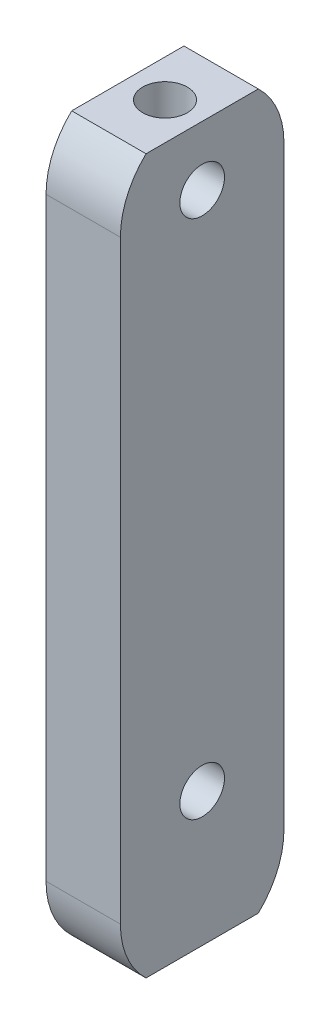
ISO-10303-21;
HEADER;
FILE_DESCRIPTION(('STEP AP214'),'2;1');
FILE_NAME('part.step','',(''),(''),'','','');
FILE_SCHEMA(('AUTOMOTIVE_DESIGN { 1 0 10303 214 1 1 1 1 }'));
ENDSEC;
DATA;
#1=APPLICATION_CONTEXT('core data for automotive mechanical design processes');
#2=APPLICATION_PROTOCOL_DEFINITION('international standard','automotive_design',2000,#1);
#3=PRODUCT_CONTEXT('',#1,'mechanical');
#4=PRODUCT('Part','Part','',(#3));
#5=PRODUCT_RELATED_PRODUCT_CATEGORY('part','',(#4));
#6=PRODUCT_DEFINITION_FORMATION('','',#4);
#7=PRODUCT_DEFINITION_CONTEXT('part definition',#1,'design');
#8=PRODUCT_DEFINITION('design','',#6,#7);
#9=PRODUCT_DEFINITION_SHAPE('','',#8);
#10=(LENGTH_UNIT() NAMED_UNIT(*) SI_UNIT(.MILLI.,.METRE.));
#11=(NAMED_UNIT(*) PLANE_ANGLE_UNIT() SI_UNIT($,.RADIAN.));
#12=(NAMED_UNIT(*) SI_UNIT($,.STERADIAN.) SOLID_ANGLE_UNIT());
#13=UNCERTAINTY_MEASURE_WITH_UNIT(LENGTH_MEASURE(1.E-05),#10,'distance_accuracy_value','');
#14=(GEOMETRIC_REPRESENTATION_CONTEXT(3) GLOBAL_UNCERTAINTY_ASSIGNED_CONTEXT((#13)) GLOBAL_UNIT_ASSIGNED_CONTEXT((#10,
#11,#12)) REPRESENTATION_CONTEXT('',''));
#15=CARTESIAN_POINT('',(0.,0.,0.));
#16=DIRECTION('',(0.,0.,1.));
#17=DIRECTION('',(1.,0.,0.));
#18=AXIS2_PLACEMENT_3D('',#15,#16,#17);
#19=CARTESIAN_POINT('',(5.,20.,0.));
#20=DIRECTION('',(-1.,0.,0.));
#21=DIRECTION('',(0.,0.,1.));
#22=AXIS2_PLACEMENT_3D('',#19,#20,#21);
#23=CYLINDRICAL_SURFACE('',#22,1.5);
#24=CARTESIAN_POINT('',(5.,20.,0.));
#25=DIRECTION('',(1.,0.,0.));
#26=DIRECTION('',(0.,0.,-1.));
#27=AXIS2_PLACEMENT_3D('',#24,#25,#26);
#28=CIRCLE('',#27,1.5);
#29=CARTESIAN_POINT('',(5.,20.,-1.49999999999999));
#30=VERTEX_POINT('',#29);
#31=EDGE_CURVE('E155',#30,#30,#28,.T.);
#32=ORIENTED_EDGE('',*,*,#31,.T.);
#33=EDGE_LOOP('',(#32));
#34=FACE_BOUND('',#33,.T.);
#35=CARTESIAN_POINT('',(0.,20.,0.));
#36=DIRECTION('',(1.,0.,0.));
#37=DIRECTION('',(0.,0.,-1.));
#38=AXIS2_PLACEMENT_3D('',#35,#36,#37);
#39=CIRCLE('',#38,1.5);
#40=CARTESIAN_POINT('',(0.,20.,-1.49999999999999));
#41=VERTEX_POINT('',#40);
#42=EDGE_CURVE('E222',#41,#41,#39,.T.);
#43=ORIENTED_EDGE('',*,*,#42,.F.);
#44=EDGE_LOOP('',(#43));
#45=FACE_BOUND('',#44,.T.);
#46=CARTESIAN_POINT('',(2.5,20.,0.));
#47=DIRECTION('',(-0.707106781186547,-0.707106781186547,0.));
#48=DIRECTION('',(-0.707106781186547,0.707106781186547,0.));
#49=AXIS2_PLACEMENT_3D('',#46,#47,#48);
#50=ELLIPSE('',#49,2.12132034355964,1.5);
#51=CARTESIAN_POINT('',(2.5,20.,-1.49999999999999));
#52=VERTEX_POINT('',#51);
#53=CARTESIAN_POINT('',(2.5,20.,1.50000000000001));
#54=VERTEX_POINT('',#53);
#55=EDGE_CURVE('E48',#52,#54,#50,.F.);
#56=ORIENTED_EDGE('',*,*,#55,.T.);
#57=CARTESIAN_POINT('',(2.5,20.,0.));
#58=DIRECTION('',(-0.707106781186547,0.707106781186547,0.));
#59=DIRECTION('',(-0.707106781186547,-0.707106781186547,0.));
#60=AXIS2_PLACEMENT_3D('',#57,#58,#59);
#61=ELLIPSE('',#60,2.12132034355964,1.5);
#62=EDGE_CURVE('E11',#54,#52,#61,.T.);
#63=ORIENTED_EDGE('',*,*,#62,.T.);
#64=EDGE_LOOP('',(#56,#63));
#65=FACE_BOUND('',#64,.T.);
#66=ADVANCED_FACE('F39',(#34,#45,#65),#23,.F.);
#67=CARTESIAN_POINT('',(5.,20.,0.));
#68=DIRECTION('',(-1.,0.,0.));
#69=DIRECTION('',(0.,0.,1.));
#70=AXIS2_PLACEMENT_3D('',#67,#68,#69);
#71=PLANE('',#70);
#72=CARTESIAN_POINT('',(5.,20.,0.));
#73=DIRECTION('',(1.,0.,0.));
#74=DIRECTION('',(0.,0.,1.));
#75=AXIS2_PLACEMENT_3D('',#72,#73,#74);
#76=CIRCLE('',#75,5.49999999999999);
#77=CARTESIAN_POINT('',(5.,24.,3.77491721763538));
#78=VERTEX_POINT('',#77);
#79=CARTESIAN_POINT('',(5.,20.,5.49999999999999));
#80=VERTEX_POINT('',#79);
#81=EDGE_CURVE('E174',#78,#80,#76,.T.);
#82=ORIENTED_EDGE('',*,*,#81,.T.);
#83=DIRECTION('',(0.,-1.,0.));
#84=VECTOR('',#83,1.);
#85=CARTESIAN_POINT('',(5.,20.,5.49999999999999));
#86=LINE('',#85,#84);
#87=CARTESIAN_POINT('',(5.,-20.,5.49999999999998));
#88=VERTEX_POINT('',#87);
#89=EDGE_CURVE('E103',#80,#88,#86,.T.);
#90=ORIENTED_EDGE('',*,*,#89,.T.);
#91=CARTESIAN_POINT('',(5.,-20.,0.));
#92=DIRECTION('',(1.,0.,0.));
#93=DIRECTION('',(0.,0.,1.));
#94=AXIS2_PLACEMENT_3D('',#91,#92,#93);
#95=CIRCLE('',#94,5.49999999999999);
#96=CARTESIAN_POINT('',(5.,-24.,3.77491721763537));
#97=VERTEX_POINT('',#96);
#98=EDGE_CURVE('E236',#88,#97,#95,.T.);
#99=ORIENTED_EDGE('',*,*,#98,.T.);
#100=DIRECTION('',(0.,0.,-1.));
#101=VECTOR('',#100,1.);
#102=CARTESIAN_POINT('',(5.,-24.,3.77491721763538));
#103=LINE('',#102,#101);
#104=CARTESIAN_POINT('',(5.,-24.,-3.77491721763538));
#105=VERTEX_POINT('',#104);
#106=EDGE_CURVE('E239',#97,#105,#103,.T.);
#107=ORIENTED_EDGE('',*,*,#106,.T.);
#108=CARTESIAN_POINT('',(5.,-20.,0.));
#109=DIRECTION('',(1.,0.,0.));
#110=DIRECTION('',(0.,0.,1.));
#111=AXIS2_PLACEMENT_3D('',#108,#109,#110);
#112=CIRCLE('',#111,5.5);
#113=CARTESIAN_POINT('',(5.,-20.,-5.5));
#114=VERTEX_POINT('',#113);
#115=EDGE_CURVE('E125',#105,#114,#112,.T.);
#116=ORIENTED_EDGE('',*,*,#115,.T.);
#117=DIRECTION('',(0.,1.,0.));
#118=VECTOR('',#117,1.);
#119=CARTESIAN_POINT('',(5.,20.,-5.49999999999999));
#120=LINE('',#119,#118);
#121=CARTESIAN_POINT('',(5.,20.,-5.49999999999999));
#122=VERTEX_POINT('',#121);
#123=EDGE_CURVE('E117',#114,#122,#120,.T.);
#124=ORIENTED_EDGE('',*,*,#123,.T.);
#125=CARTESIAN_POINT('',(5.,20.,0.));
#126=DIRECTION('',(1.,0.,0.));
#127=DIRECTION('',(0.,0.,1.));
#128=AXIS2_PLACEMENT_3D('',#125,#126,#127);
#129=CIRCLE('',#128,5.5);
#130=CARTESIAN_POINT('',(5.,24.,-3.77491721763538));
#131=VERTEX_POINT('',#130);
#132=EDGE_CURVE('E122',#122,#131,#129,.T.);
#133=ORIENTED_EDGE('',*,*,#132,.T.);
#134=DIRECTION('',(0.,0.,1.));
#135=VECTOR('',#134,1.);
#136=CARTESIAN_POINT('',(5.,24.,3.77491721763538));
#137=LINE('',#136,#135);
#138=EDGE_CURVE('E61',#131,#78,#137,.T.);
#139=ORIENTED_EDGE('',*,*,#138,.T.);
#140=EDGE_LOOP('',(#82,#90,#99,#107,#116,#124,#133,#139));
#141=FACE_BOUND('',#140,.T.);
#142=ORIENTED_EDGE('',*,*,#31,.F.);
#143=EDGE_LOOP('',(#142));
#144=FACE_BOUND('',#143,.T.);
#145=CARTESIAN_POINT('',(5.,-15.,0.));
#146=DIRECTION('',(1.,0.,0.));
#147=DIRECTION('',(0.,0.,-1.));
#148=AXIS2_PLACEMENT_3D('',#145,#146,#147);
#149=CIRCLE('',#148,1.5);
#150=CARTESIAN_POINT('',(5.,-15.,-1.5));
#151=VERTEX_POINT('',#150);
#152=EDGE_CURVE('E218',#151,#151,#149,.T.);
#153=ORIENTED_EDGE('',*,*,#152,.F.);
#154=EDGE_LOOP('',(#153));
#155=FACE_BOUND('',#154,.T.);
#156=ADVANCED_FACE('F119',(#141,#144,#155),#71,.F.);
#157=CARTESIAN_POINT('',(0.,20.,0.));
#158=DIRECTION('',(-1.,0.,0.));
#159=DIRECTION('',(0.,0.,1.));
#160=AXIS2_PLACEMENT_3D('',#157,#158,#159);
#161=PLANE('',#160);
#162=ORIENTED_EDGE('',*,*,#42,.T.);
#163=EDGE_LOOP('',(#162));
#164=FACE_BOUND('',#163,.T.);
#165=CARTESIAN_POINT('',(0.,20.,0.));
#166=DIRECTION('',(1.,0.,0.));
#167=DIRECTION('',(0.,0.,1.));
#168=AXIS2_PLACEMENT_3D('',#165,#166,#167);
#169=CIRCLE('',#168,5.49999999999999);
#170=CARTESIAN_POINT('',(0.,24.,3.77491721763538));
#171=VERTEX_POINT('',#170);
#172=CARTESIAN_POINT('',(0.,20.,5.49999999999999));
#173=VERTEX_POINT('',#172);
#174=EDGE_CURVE('E150',#171,#173,#169,.T.);
#175=ORIENTED_EDGE('',*,*,#174,.F.);
#176=DIRECTION('',(0.,0.,1.));
#177=VECTOR('',#176,1.);
#178=CARTESIAN_POINT('',(0.,24.,3.77491721763538));
#179=LINE('',#178,#177);
#180=CARTESIAN_POINT('',(0.,24.,-3.77491721763538));
#181=VERTEX_POINT('',#180);
#182=EDGE_CURVE('E94',#181,#171,#179,.T.);
#183=ORIENTED_EDGE('',*,*,#182,.F.);
#184=CARTESIAN_POINT('',(0.,20.,0.));
#185=DIRECTION('',(1.,0.,0.));
#186=DIRECTION('',(0.,0.,1.));
#187=AXIS2_PLACEMENT_3D('',#184,#185,#186);
#188=CIRCLE('',#187,5.5);
#189=CARTESIAN_POINT('',(0.,20.,-5.49999999999999));
#190=VERTEX_POINT('',#189);
#191=EDGE_CURVE('E169',#190,#181,#188,.T.);
#192=ORIENTED_EDGE('',*,*,#191,.F.);
#193=DIRECTION('',(0.,1.,0.));
#194=VECTOR('',#193,1.);
#195=CARTESIAN_POINT('',(0.,20.,-5.49999999999999));
#196=LINE('',#195,#194);
#197=CARTESIAN_POINT('',(0.,-20.,-5.5));
#198=VERTEX_POINT('',#197);
#199=EDGE_CURVE('E135',#198,#190,#196,.T.);
#200=ORIENTED_EDGE('',*,*,#199,.F.);
#201=CARTESIAN_POINT('',(0.,-20.,0.));
#202=DIRECTION('',(1.,0.,0.));
#203=DIRECTION('',(0.,0.,1.));
#204=AXIS2_PLACEMENT_3D('',#201,#202,#203);
#205=CIRCLE('',#204,5.5);
#206=CARTESIAN_POINT('',(0.,-24.,-3.77491721763538));
#207=VERTEX_POINT('',#206);
#208=EDGE_CURVE('E164',#207,#198,#205,.T.);
#209=ORIENTED_EDGE('',*,*,#208,.F.);
#210=DIRECTION('',(0.,0.,-1.));
#211=VECTOR('',#210,1.);
#212=CARTESIAN_POINT('',(0.,-24.,3.77491721763538));
#213=LINE('',#212,#211);
#214=CARTESIAN_POINT('',(0.,-24.,3.77491721763537));
#215=VERTEX_POINT('',#214);
#216=EDGE_CURVE('E161',#215,#207,#213,.T.);
#217=ORIENTED_EDGE('',*,*,#216,.F.);
#218=CARTESIAN_POINT('',(0.,-20.,0.));
#219=DIRECTION('',(1.,0.,0.));
#220=DIRECTION('',(0.,0.,1.));
#221=AXIS2_PLACEMENT_3D('',#218,#219,#220);
#222=CIRCLE('',#221,5.49999999999999);
#223=CARTESIAN_POINT('',(0.,-20.,5.49999999999998));
#224=VERTEX_POINT('',#223);
#225=EDGE_CURVE('E158',#224,#215,#222,.T.);
#226=ORIENTED_EDGE('',*,*,#225,.F.);
#227=DIRECTION('',(0.,-1.,0.));
#228=VECTOR('',#227,1.);
#229=CARTESIAN_POINT('',(0.,20.,5.49999999999999));
#230=LINE('',#229,#228);
#231=EDGE_CURVE('E154',#173,#224,#230,.T.);
#232=ORIENTED_EDGE('',*,*,#231,.F.);
#233=EDGE_LOOP('',(#175,#183,#192,#200,#209,#217,#226,#232));
#234=FACE_BOUND('',#233,.T.);
#235=CARTESIAN_POINT('',(0.,-15.,0.));
#236=DIRECTION('',(1.,0.,0.));
#237=DIRECTION('',(0.,0.,-1.));
#238=AXIS2_PLACEMENT_3D('',#235,#236,#237);
#239=CIRCLE('',#238,1.5);
#240=CARTESIAN_POINT('',(0.,-15.,-1.5));
#241=VERTEX_POINT('',#240);
#242=EDGE_CURVE('E216',#241,#241,#239,.T.);
#243=ORIENTED_EDGE('',*,*,#242,.T.);
#244=EDGE_LOOP('',(#243));
#245=FACE_BOUND('',#244,.T.);
#246=ADVANCED_FACE('F254',(#164,#234,#245),#161,.T.);
#247=CARTESIAN_POINT('',(5.,20.,0.));
#248=DIRECTION('',(-1.,0.,0.));
#249=DIRECTION('',(0.,0.,1.));
#250=AXIS2_PLACEMENT_3D('',#247,#248,#249);
#251=CYLINDRICAL_SURFACE('',#250,5.49999999999999);
#252=ORIENTED_EDGE('',*,*,#174,.T.);
#253=DIRECTION('',(-1.,0.,0.));
#254=VECTOR('',#253,1.);
#255=CARTESIAN_POINT('',(5.,20.,5.49999999999999));
#256=LINE('',#255,#254);
#257=EDGE_CURVE('E193',#80,#173,#256,.T.);
#258=ORIENTED_EDGE('',*,*,#257,.F.);
#259=ORIENTED_EDGE('',*,*,#81,.F.);
#260=DIRECTION('',(-1.,0.,0.));
#261=VECTOR('',#260,1.);
#262=CARTESIAN_POINT('',(5.,24.,3.77491721763538));
#263=LINE('',#262,#261);
#264=EDGE_CURVE('E146',#78,#171,#263,.T.);
#265=ORIENTED_EDGE('',*,*,#264,.T.);
#266=EDGE_LOOP('',(#252,#258,#259,#265));
#267=FACE_BOUND('',#266,.T.);
#268=ADVANCED_FACE('F41',(#267),#251,.T.);
#269=CARTESIAN_POINT('',(5.,20.,5.49999999999999));
#270=DIRECTION('',(0.,0.,-1.));
#271=DIRECTION('',(0.,1.,0.));
#272=AXIS2_PLACEMENT_3D('',#269,#270,#271);
#273=PLANE('',#272);
#274=ORIENTED_EDGE('',*,*,#231,.T.);
#275=DIRECTION('',(-1.,0.,0.));
#276=VECTOR('',#275,1.);
#277=CARTESIAN_POINT('',(5.,-20.,5.49999999999998));
#278=LINE('',#277,#276);
#279=EDGE_CURVE('E189',#88,#224,#278,.T.);
#280=ORIENTED_EDGE('',*,*,#279,.F.);
#281=ORIENTED_EDGE('',*,*,#89,.F.);
#282=ORIENTED_EDGE('',*,*,#257,.T.);
#283=EDGE_LOOP('',(#274,#280,#281,#282));
#284=FACE_BOUND('',#283,.T.);
#285=ADVANCED_FACE('F260',(#284),#273,.F.);
#286=CARTESIAN_POINT('',(5.,-20.,0.));
#287=DIRECTION('',(-1.,0.,0.));
#288=DIRECTION('',(0.,0.,1.));
#289=AXIS2_PLACEMENT_3D('',#286,#287,#288);
#290=CYLINDRICAL_SURFACE('',#289,5.49999999999999);
#291=ORIENTED_EDGE('',*,*,#225,.T.);
#292=DIRECTION('',(-1.,0.,0.));
#293=VECTOR('',#292,1.);
#294=CARTESIAN_POINT('',(5.,-24.,3.77491721763537));
#295=LINE('',#294,#293);
#296=EDGE_CURVE('E185',#97,#215,#295,.T.);
#297=ORIENTED_EDGE('',*,*,#296,.F.);
#298=ORIENTED_EDGE('',*,*,#98,.F.);
#299=ORIENTED_EDGE('',*,*,#279,.T.);
#300=EDGE_LOOP('',(#291,#297,#298,#299));
#301=FACE_BOUND('',#300,.T.);
#302=ADVANCED_FACE('F263',(#301),#290,.T.);
#303=CARTESIAN_POINT('',(5.,-24.,3.77491721763538));
#304=DIRECTION('',(0.,1.,0.));
#305=DIRECTION('',(0.,0.,1.));
#306=AXIS2_PLACEMENT_3D('',#303,#304,#305);
#307=PLANE('',#306);
#308=CARTESIAN_POINT('',(2.5,-24.,0.));
#309=DIRECTION('',(0.,-1.,0.));
#310=DIRECTION('',(0.,0.,-1.));
#311=AXIS2_PLACEMENT_3D('',#308,#309,#310);
#312=CIRCLE('',#311,1.5);
#313=CARTESIAN_POINT('',(2.5,-24.,-1.5));
#314=VERTEX_POINT('',#313);
#315=EDGE_CURVE('E207',#314,#314,#312,.T.);
#316=ORIENTED_EDGE('',*,*,#315,.F.);
#317=EDGE_LOOP('',(#316));
#318=FACE_BOUND('',#317,.T.);
#319=ORIENTED_EDGE('',*,*,#216,.T.);
#320=DIRECTION('',(-1.,0.,0.));
#321=VECTOR('',#320,1.);
#322=CARTESIAN_POINT('',(5.,-24.,-3.77491721763538));
#323=LINE('',#322,#321);
#324=EDGE_CURVE('E181',#105,#207,#323,.T.);
#325=ORIENTED_EDGE('',*,*,#324,.F.);
#326=ORIENTED_EDGE('',*,*,#106,.F.);
#327=ORIENTED_EDGE('',*,*,#296,.T.);
#328=EDGE_LOOP('',(#319,#325,#326,#327));
#329=FACE_BOUND('',#328,.T.);
#330=ADVANCED_FACE('F247',(#318,#329),#307,.F.);
#331=CARTESIAN_POINT('',(5.,-20.,0.));
#332=DIRECTION('',(-1.,0.,0.));
#333=DIRECTION('',(0.,0.,1.));
#334=AXIS2_PLACEMENT_3D('',#331,#332,#333);
#335=CYLINDRICAL_SURFACE('',#334,5.5);
#336=ORIENTED_EDGE('',*,*,#208,.T.);
#337=DIRECTION('',(-1.,0.,0.));
#338=VECTOR('',#337,1.);
#339=CARTESIAN_POINT('',(5.,-20.,-5.5));
#340=LINE('',#339,#338);
#341=EDGE_CURVE('E139',#114,#198,#340,.T.);
#342=ORIENTED_EDGE('',*,*,#341,.F.);
#343=ORIENTED_EDGE('',*,*,#115,.F.);
#344=ORIENTED_EDGE('',*,*,#324,.T.);
#345=EDGE_LOOP('',(#336,#342,#343,#344));
#346=FACE_BOUND('',#345,.T.);
#347=ADVANCED_FACE('F251',(#346),#335,.T.);
#348=CARTESIAN_POINT('',(5.,20.,-5.49999999999999));
#349=DIRECTION('',(0.,0.,1.));
#350=DIRECTION('',(0.,-1.,0.));
#351=AXIS2_PLACEMENT_3D('',#348,#349,#350);
#352=PLANE('',#351);
#353=ORIENTED_EDGE('',*,*,#199,.T.);
#354=DIRECTION('',(-1.,0.,0.));
#355=VECTOR('',#354,1.);
#356=CARTESIAN_POINT('',(5.,20.,-5.49999999999999));
#357=LINE('',#356,#355);
#358=EDGE_CURVE('E132',#122,#190,#357,.T.);
#359=ORIENTED_EDGE('',*,*,#358,.F.);
#360=ORIENTED_EDGE('',*,*,#123,.F.);
#361=ORIENTED_EDGE('',*,*,#341,.T.);
#362=EDGE_LOOP('',(#353,#359,#360,#361));
#363=FACE_BOUND('',#362,.T.);
#364=ADVANCED_FACE('F133',(#363),#352,.F.);
#365=CARTESIAN_POINT('',(5.,20.,0.));
#366=DIRECTION('',(-1.,0.,0.));
#367=DIRECTION('',(0.,0.,1.));
#368=AXIS2_PLACEMENT_3D('',#365,#366,#367);
#369=CYLINDRICAL_SURFACE('',#368,5.5);
#370=ORIENTED_EDGE('',*,*,#191,.T.);
#371=DIRECTION('',(-1.,0.,0.));
#372=VECTOR('',#371,1.);
#373=CARTESIAN_POINT('',(5.,24.,-3.77491721763538));
#374=LINE('',#373,#372);
#375=EDGE_CURVE('E140',#131,#181,#374,.T.);
#376=ORIENTED_EDGE('',*,*,#375,.F.);
#377=ORIENTED_EDGE('',*,*,#132,.F.);
#378=ORIENTED_EDGE('',*,*,#358,.T.);
#379=EDGE_LOOP('',(#370,#376,#377,#378));
#380=FACE_BOUND('',#379,.T.);
#381=ADVANCED_FACE('F142',(#380),#369,.T.);
#382=CARTESIAN_POINT('',(5.,24.,3.77491721763538));
#383=DIRECTION('',(0.,-1.,0.));
#384=DIRECTION('',(0.,0.,-1.));
#385=AXIS2_PLACEMENT_3D('',#382,#383,#384);
#386=PLANE('',#385);
#387=CARTESIAN_POINT('',(2.5,24.,0.));
#388=DIRECTION('',(0.,-1.,0.));
#389=DIRECTION('',(0.,0.,-1.));
#390=AXIS2_PLACEMENT_3D('',#387,#388,#389);
#391=CIRCLE('',#390,1.5);
#392=CARTESIAN_POINT('',(2.5,24.,-1.5));
#393=VERTEX_POINT('',#392);
#394=EDGE_CURVE('E204',#393,#393,#391,.T.);
#395=ORIENTED_EDGE('',*,*,#394,.T.);
#396=EDGE_LOOP('',(#395));
#397=FACE_BOUND('',#396,.T.);
#398=ORIENTED_EDGE('',*,*,#182,.T.);
#399=ORIENTED_EDGE('',*,*,#264,.F.);
#400=ORIENTED_EDGE('',*,*,#138,.F.);
#401=ORIENTED_EDGE('',*,*,#375,.T.);
#402=EDGE_LOOP('',(#398,#399,#400,#401));
#403=FACE_BOUND('',#402,.T.);
#404=ADVANCED_FACE('F256',(#397,#403),#386,.F.);
#405=CARTESIAN_POINT('',(5.,-15.,0.));
#406=DIRECTION('',(-1.,0.,0.));
#407=DIRECTION('',(0.,0.,1.));
#408=AXIS2_PLACEMENT_3D('',#405,#406,#407);
#409=CYLINDRICAL_SURFACE('',#408,1.5);
#410=ORIENTED_EDGE('',*,*,#152,.T.);
#411=EDGE_LOOP('',(#410));
#412=FACE_BOUND('',#411,.T.);
#413=ORIENTED_EDGE('',*,*,#242,.F.);
#414=EDGE_LOOP('',(#413));
#415=FACE_BOUND('',#414,.T.);
#416=ADVANCED_FACE('F281',(#412,#415),#409,.F.);
#417=CARTESIAN_POINT('',(2.5,-19.,0.));
#418=DIRECTION('',(0.,-1.,0.));
#419=DIRECTION('',(0.,0.,-1.));
#420=AXIS2_PLACEMENT_3D('',#417,#418,#419);
#421=CYLINDRICAL_SURFACE('',#420,1.5);
#422=CARTESIAN_POINT('',(2.5,-19.,0.));
#423=DIRECTION('',(0.,-1.,0.));
#424=DIRECTION('',(0.,0.,-1.));
#425=AXIS2_PLACEMENT_3D('',#422,#423,#424);
#426=CIRCLE('',#425,1.5);
#427=CARTESIAN_POINT('',(2.5,-19.,-1.5));
#428=VERTEX_POINT('',#427);
#429=EDGE_CURVE('E211',#428,#428,#426,.T.);
#430=ORIENTED_EDGE('',*,*,#429,.F.);
#431=EDGE_LOOP('',(#430));
#432=FACE_BOUND('',#431,.T.);
#433=ORIENTED_EDGE('',*,*,#315,.T.);
#434=EDGE_LOOP('',(#433));
#435=FACE_BOUND('',#434,.T.);
#436=ADVANCED_FACE('F317',(#432,#435),#421,.F.);
#437=CARTESIAN_POINT('',(2.5,-19.,0.));
#438=DIRECTION('',(0.,-1.,0.));
#439=DIRECTION('',(0.,0.,-1.));
#440=AXIS2_PLACEMENT_3D('',#437,#438,#439);
#441=PLANE('',#440);
#442=ORIENTED_EDGE('',*,*,#429,.T.);
#443=EDGE_LOOP('',(#442));
#444=FACE_BOUND('',#443,.T.);
#445=ADVANCED_FACE('F200',(#444),#441,.T.);
#446=CARTESIAN_POINT('',(2.5,20.,0.));
#447=DIRECTION('',(0.,1.,0.));
#448=DIRECTION('',(0.,0.,1.));
#449=AXIS2_PLACEMENT_3D('',#446,#447,#448);
#450=CYLINDRICAL_SURFACE('',#449,1.5);
#451=ORIENTED_EDGE('',*,*,#55,.F.);
#452=ORIENTED_EDGE('',*,*,#62,.F.);
#453=EDGE_LOOP('',(#451,#452));
#454=FACE_BOUND('',#453,.T.);
#455=ORIENTED_EDGE('',*,*,#394,.F.);
#456=EDGE_LOOP('',(#455));
#457=FACE_BOUND('',#456,.T.);
#458=ADVANCED_FACE('F197',(#454,#457),#450,.F.);
#459=CLOSED_SHELL('',(#66,#156,#246,#268,#285,#302,#330,#347,#364,#381,#404,#416,#436,#445,#458));
#460=MANIFOLD_SOLID_BREP('B2',#459);
#461=ADVANCED_BREP_SHAPE_REPRESENTATION('',(#18,#460),#14);
#462=SHAPE_DEFINITION_REPRESENTATION(#9,#461);
ENDSEC;
END-ISO-10303-21;
